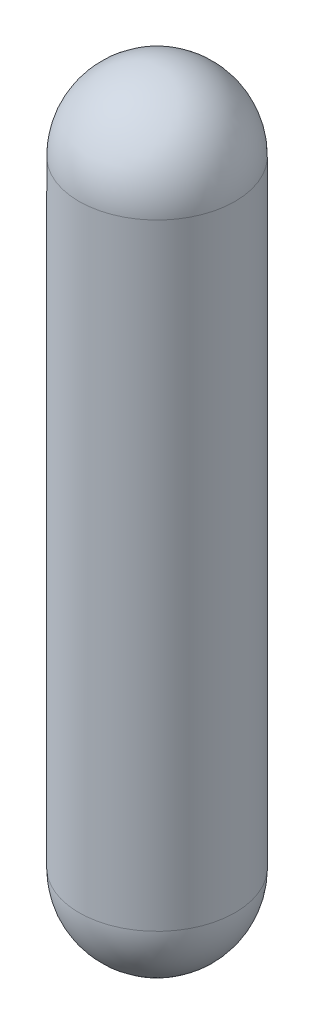
ISO-10303-21;
HEADER;
FILE_DESCRIPTION(('STEP AP214'),'2;1');
FILE_NAME('part.step','',(''),(''),'','','');
FILE_SCHEMA(('AUTOMOTIVE_DESIGN { 1 0 10303 214 1 1 1 1 }'));
ENDSEC;
DATA;
#1=APPLICATION_CONTEXT('core data for automotive mechanical design processes');
#2=APPLICATION_PROTOCOL_DEFINITION('international standard','automotive_design',2000,#1);
#3=PRODUCT_CONTEXT('',#1,'mechanical');
#4=PRODUCT('Part','Part','',(#3));
#5=PRODUCT_RELATED_PRODUCT_CATEGORY('part','',(#4));
#6=PRODUCT_DEFINITION_FORMATION('','',#4);
#7=PRODUCT_DEFINITION_CONTEXT('part definition',#1,'design');
#8=PRODUCT_DEFINITION('design','',#6,#7);
#9=PRODUCT_DEFINITION_SHAPE('','',#8);
#10=(LENGTH_UNIT() NAMED_UNIT(*) SI_UNIT(.MILLI.,.METRE.));
#11=(NAMED_UNIT(*) PLANE_ANGLE_UNIT() SI_UNIT($,.RADIAN.));
#12=(NAMED_UNIT(*) SI_UNIT($,.STERADIAN.) SOLID_ANGLE_UNIT());
#13=UNCERTAINTY_MEASURE_WITH_UNIT(LENGTH_MEASURE(1.E-05),#10,'distance_accuracy_value','');
#14=(GEOMETRIC_REPRESENTATION_CONTEXT(3) GLOBAL_UNCERTAINTY_ASSIGNED_CONTEXT((#13)) GLOBAL_UNIT_ASSIGNED_CONTEXT((#10,
#11,#12)) REPRESENTATION_CONTEXT('',''));
#15=CARTESIAN_POINT('',(0.,0.,0.));
#16=DIRECTION('',(0.,0.,1.));
#17=DIRECTION('',(1.,0.,0.));
#18=AXIS2_PLACEMENT_3D('',#15,#16,#17);
#19=CARTESIAN_POINT('',(0.,402.49983,0.));
#20=DIRECTION('',(0.,-1.,0.));
#21=DIRECTION('',(0.,0.,-1.));
#22=AXIS2_PLACEMENT_3D('',#19,#20,#21);
#23=CYLINDRICAL_SURFACE('',#22,102.);
#24=CARTESIAN_POINT('',(0.,402.49983,0.));
#25=DIRECTION('',(0.,1.,0.));
#26=DIRECTION('',(0.,0.,1.));
#27=AXIS2_PLACEMENT_3D('',#24,#25,#26);
#28=CIRCLE('',#27,102.);
#29=CARTESIAN_POINT('',(0.,402.49983,102.));
#30=VERTEX_POINT('',#29);
#31=EDGE_CURVE('E45',#30,#30,#28,.T.);
#32=ORIENTED_EDGE('',*,*,#31,.F.);
#33=EDGE_LOOP('',(#32));
#34=FACE_BOUND('',#33,.T.);
#35=CARTESIAN_POINT('',(0.,-402.49983,0.));
#36=DIRECTION('',(0.,-1.,0.));
#37=DIRECTION('',(1.,0.,0.));
#38=AXIS2_PLACEMENT_3D('',#35,#36,#37);
#39=CIRCLE('',#38,102.);
#40=CARTESIAN_POINT('',(102.,-402.49983,0.));
#41=VERTEX_POINT('',#40);
#42=EDGE_CURVE('E58',#41,#41,#39,.T.);
#43=ORIENTED_EDGE('',*,*,#42,.F.);
#44=EDGE_LOOP('',(#43));
#45=FACE_BOUND('',#44,.T.);
#46=ADVANCED_FACE('F37',(#34,#45),#23,.T.);
#47=CARTESIAN_POINT('',(0.,402.49983,0.));
#48=DIRECTION('',(-1.,0.,0.));
#49=DIRECTION('',(0.,0.,-1.));
#50=AXIS2_PLACEMENT_3D('',#47,#48,#49);
#51=SPHERICAL_SURFACE('',#50,102.);
#52=CARTESIAN_POINT('',(0.,402.49983,0.));
#53=DIRECTION('',(0.,1.,0.));
#54=DIRECTION('',(0.,0.,1.));
#55=AXIS2_PLACEMENT_3D('',#52,#53,#54);
#56=SPHERICAL_SURFACE('',#55,102.);
#57=ORIENTED_EDGE('',*,*,#31,.T.);
#58=EDGE_LOOP('',(#57));
#59=FACE_BOUND('',#58,.T.);
#60=ADVANCED_FACE('F65',(#59),#56,.T.);
#61=CARTESIAN_POINT('',(0.,-402.49983,0.));
#62=DIRECTION('',(-1.,0.,0.));
#63=DIRECTION('',(0.,0.,-1.));
#64=AXIS2_PLACEMENT_3D('',#61,#62,#63);
#65=SPHERICAL_SURFACE('',#64,102.);
#66=CARTESIAN_POINT('',(0.,-402.49983,0.));
#67=DIRECTION('',(0.,-1.,0.));
#68=DIRECTION('',(1.,0.,0.));
#69=AXIS2_PLACEMENT_3D('',#66,#67,#68);
#70=SPHERICAL_SURFACE('',#69,102.);
#71=ORIENTED_EDGE('',*,*,#42,.T.);
#72=EDGE_LOOP('',(#71));
#73=FACE_BOUND('',#72,.T.);
#74=ADVANCED_FACE('F62',(#73),#70,.T.);
#75=CLOSED_SHELL('',(#46,#60,#74));
#76=CARTESIAN_POINT('',(0.,-402.49983,0.));
#77=DIRECTION('',(0.,1.,0.));
#78=DIRECTION('',(1.,0.,0.));
#79=AXIS2_PLACEMENT_3D('',#76,#77,#78);
#80=PLANE('',#79);
#81=CARTESIAN_POINT('',(0.,-402.49983,0.));
#82=DIRECTION('',(0.,1.,0.));
#83=DIRECTION('',(0.,0.,1.));
#84=AXIS2_PLACEMENT_3D('',#81,#82,#83);
#85=CIRCLE('',#84,95.65);
#86=CARTESIAN_POINT('',(0.,-402.49983,95.65));
#87=VERTEX_POINT('',#86);
#88=EDGE_CURVE('E49',#87,#87,#85,.T.);
#89=ORIENTED_EDGE('',*,*,#88,.T.);
#90=EDGE_LOOP('',(#89));
#91=FACE_BOUND('',#90,.T.);
#92=ADVANCED_FACE('F85',(#91),#80,.T.);
#93=CARTESIAN_POINT('',(0.,402.49983,0.));
#94=DIRECTION('',(0.,-1.,0.));
#95=DIRECTION('',(1.,0.,0.));
#96=AXIS2_PLACEMENT_3D('',#93,#94,#95);
#97=PLANE('',#96);
#98=CARTESIAN_POINT('',(0.,402.49983,0.));
#99=DIRECTION('',(0.,-1.,0.));
#100=DIRECTION('',(0.,0.,-1.));
#101=AXIS2_PLACEMENT_3D('',#98,#99,#100);
#102=CIRCLE('',#101,95.65);
#103=CARTESIAN_POINT('',(0.,402.49983,-95.65));
#104=VERTEX_POINT('',#103);
#105=EDGE_CURVE('E53',#104,#104,#102,.T.);
#106=ORIENTED_EDGE('',*,*,#105,.T.);
#107=EDGE_LOOP('',(#106));
#108=FACE_BOUND('',#107,.T.);
#109=ADVANCED_FACE('F87',(#108),#97,.T.);
#110=CARTESIAN_POINT('',(0.,402.49983,0.));
#111=DIRECTION('',(0.,-1.,0.));
#112=DIRECTION('',(0.,0.,-1.));
#113=AXIS2_PLACEMENT_3D('',#110,#111,#112);
#114=CYLINDRICAL_SURFACE('',#113,95.65);
#115=ORIENTED_EDGE('',*,*,#105,.F.);
#116=EDGE_LOOP('',(#115));
#117=FACE_BOUND('',#116,.T.);
#118=ORIENTED_EDGE('',*,*,#88,.F.);
#119=EDGE_LOOP('',(#118));
#120=FACE_BOUND('',#119,.T.);
#121=ADVANCED_FACE('F73',(#117,#120),#114,.F.);
#122=CLOSED_SHELL('',(#92,#109,#121));
#123=CARTESIAN_POINT('',(0.,402.49983,0.));
#124=DIRECTION('',(-1.,0.,0.));
#125=DIRECTION('',(0.,0.,-1.));
#126=AXIS2_PLACEMENT_3D('',#123,#124,#125);
#127=SPHERICAL_SURFACE('',#126,95.65);
#128=CARTESIAN_POINT('',(0.,402.49983,0.));
#129=DIRECTION('',(0.,-1.,0.));
#130=DIRECTION('',(0.,0.,-1.));
#131=AXIS2_PLACEMENT_3D('',#128,#129,#130);
#132=SPHERICAL_SURFACE('',#131,95.65);
#133=CARTESIAN_POINT('',(0.,408.84983,0.));
#134=DIRECTION('',(0.,-1.,0.));
#135=DIRECTION('',(0.,0.,-1.));
#136=AXIS2_PLACEMENT_3D('',#133,#134,#135);
#137=CIRCLE('',#136,95.4389857448202);
#138=CARTESIAN_POINT('',(0.,408.84983,-95.4389857448202));
#139=VERTEX_POINT('',#138);
#140=EDGE_CURVE('E10',#139,#139,#137,.F.);
#141=ORIENTED_EDGE('',*,*,#140,.F.);
#142=EDGE_LOOP('',(#141));
#143=FACE_BOUND('',#142,.T.);
#144=ADVANCED_FACE('F74',(#143),#132,.F.);
#145=CARTESIAN_POINT('',(0.,408.84983,0.));
#146=DIRECTION('',(0.,-1.,0.));
#147=DIRECTION('',(1.,0.,0.));
#148=AXIS2_PLACEMENT_3D('',#145,#146,#147);
#149=PLANE('',#148);
#150=ORIENTED_EDGE('',*,*,#140,.T.);
#151=EDGE_LOOP('',(#150));
#152=FACE_BOUND('',#151,.T.);
#153=ADVANCED_FACE('F39',(#152),#149,.F.);
#154=CLOSED_SHELL('',(#144,#153));
#155=ORIENTED_CLOSED_SHELL('',*,#122,.T.);
#156=ORIENTED_CLOSED_SHELL('',*,#154,.T.);
#157=BREP_WITH_VOIDS('B2',#75,(#155,#156));
#158=ADVANCED_BREP_SHAPE_REPRESENTATION('',(#18,#157),#14);
#159=SHAPE_DEFINITION_REPRESENTATION(#9,#158);
ENDSEC;
END-ISO-10303-21;
